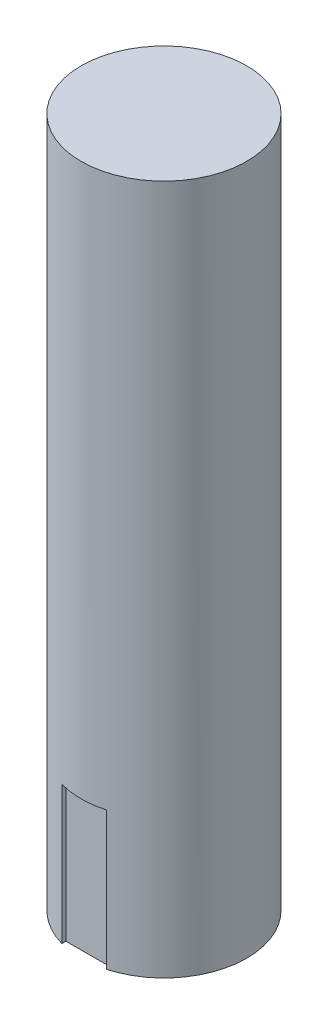
ISO-10303-21;
HEADER;
FILE_DESCRIPTION(('STEP AP214'),'2;1');
FILE_NAME('part.step','',(''),(''),'','','');
FILE_SCHEMA(('AUTOMOTIVE_DESIGN { 1 0 10303 214 1 1 1 1 }'));
ENDSEC;
DATA;
#1=APPLICATION_CONTEXT('core data for automotive mechanical design processes');
#2=APPLICATION_PROTOCOL_DEFINITION('international standard','automotive_design',2000,#1);
#3=PRODUCT_CONTEXT('',#1,'mechanical');
#4=PRODUCT('Part','Part','',(#3));
#5=PRODUCT_RELATED_PRODUCT_CATEGORY('part','',(#4));
#6=PRODUCT_DEFINITION_FORMATION('','',#4);
#7=PRODUCT_DEFINITION_CONTEXT('part definition',#1,'design');
#8=PRODUCT_DEFINITION('design','',#6,#7);
#9=PRODUCT_DEFINITION_SHAPE('','',#8);
#10=(LENGTH_UNIT() NAMED_UNIT(*) SI_UNIT(.MILLI.,.METRE.));
#11=(NAMED_UNIT(*) PLANE_ANGLE_UNIT() SI_UNIT($,.RADIAN.));
#12=(NAMED_UNIT(*) SI_UNIT($,.STERADIAN.) SOLID_ANGLE_UNIT());
#13=UNCERTAINTY_MEASURE_WITH_UNIT(LENGTH_MEASURE(1.E-05),#10,'distance_accuracy_value','');
#14=(GEOMETRIC_REPRESENTATION_CONTEXT(3) GLOBAL_UNCERTAINTY_ASSIGNED_CONTEXT((#13)) GLOBAL_UNIT_ASSIGNED_CONTEXT((#10,
#11,#12)) REPRESENTATION_CONTEXT('',''));
#15=CARTESIAN_POINT('',(0.,0.,0.));
#16=DIRECTION('',(0.,0.,1.));
#17=DIRECTION('',(1.,0.,0.));
#18=AXIS2_PLACEMENT_3D('',#15,#16,#17);
#19=CARTESIAN_POINT('',(0.,125.,0.));
#20=DIRECTION('',(0.,-1.,0.));
#21=DIRECTION('',(0.,0.,-1.));
#22=AXIS2_PLACEMENT_3D('',#19,#20,#21);
#23=CYLINDRICAL_SURFACE('',#22,30.);
#24=CARTESIAN_POINT('',(0.,125.,0.));
#25=DIRECTION('',(0.,1.,0.));
#26=DIRECTION('',(0.,0.,1.));
#27=AXIS2_PLACEMENT_3D('',#24,#25,#26);
#28=CIRCLE('',#27,30.);
#29=CARTESIAN_POINT('',(0.,125.,30.));
#30=VERTEX_POINT('',#29);
#31=EDGE_CURVE('E46',#30,#30,#28,.T.);
#32=ORIENTED_EDGE('',*,*,#31,.F.);
#33=EDGE_LOOP('',(#32));
#34=FACE_BOUND('',#33,.T.);
#35=DIRECTION('',(0.,-1.,0.));
#36=VECTOR('',#35,1.);
#37=CARTESIAN_POINT('',(-8.09533569525371,125.,28.8871171974836));
#38=LINE('',#37,#36);
#39=CARTESIAN_POINT('',(-8.09533569525371,-75.,28.8871171974836));
#40=VERTEX_POINT('',#39);
#41=CARTESIAN_POINT('',(-8.09533569525371,-125.,28.8871171974836));
#42=VERTEX_POINT('',#41);
#43=EDGE_CURVE('E105',#40,#42,#38,.T.);
#44=ORIENTED_EDGE('',*,*,#43,.F.);
#45=CARTESIAN_POINT('',(0.,-75.,0.));
#46=DIRECTION('',(0.,-1.,0.));
#47=DIRECTION('',(0.,0.,-1.));
#48=AXIS2_PLACEMENT_3D('',#45,#46,#47);
#49=CIRCLE('',#48,30.);
#50=CARTESIAN_POINT('',(8.09533569525371,-75.,28.8871171974836));
#51=VERTEX_POINT('',#50);
#52=EDGE_CURVE('E11',#51,#40,#49,.T.);
#53=ORIENTED_EDGE('',*,*,#52,.F.);
#54=DIRECTION('',(0.,-1.,0.));
#55=VECTOR('',#54,1.);
#56=CARTESIAN_POINT('',(8.09533569525371,125.,28.8871171974836));
#57=LINE('',#56,#55);
#58=CARTESIAN_POINT('',(8.09533569525371,-125.,28.8871171974836));
#59=VERTEX_POINT('',#58);
#60=EDGE_CURVE('E101',#51,#59,#57,.T.);
#61=ORIENTED_EDGE('',*,*,#60,.T.);
#62=CARTESIAN_POINT('',(0.,-125.,0.));
#63=DIRECTION('',(0.,1.,0.));
#64=DIRECTION('',(0.,0.,1.));
#65=AXIS2_PLACEMENT_3D('',#62,#63,#64);
#66=CIRCLE('',#65,30.);
#67=EDGE_CURVE('E107',#59,#42,#66,.T.);
#68=ORIENTED_EDGE('',*,*,#67,.T.);
#69=EDGE_LOOP('',(#44,#53,#61,#68));
#70=FACE_BOUND('',#69,.T.);
#71=ADVANCED_FACE('F39',(#34,#70),#23,.T.);
#72=CARTESIAN_POINT('',(0.,-125.,0.));
#73=DIRECTION('',(0.,1.,0.));
#74=DIRECTION('',(0.,0.,1.));
#75=AXIS2_PLACEMENT_3D('',#72,#73,#74);
#76=PLANE('',#75);
#77=DIRECTION('',(0.,0.,1.));
#78=VECTOR('',#77,1.);
#79=CARTESIAN_POINT('',(-8.09533569525371,-125.,0.));
#80=LINE('',#79,#78);
#81=CARTESIAN_POINT('',(-8.09533569525371,-125.,27.42));
#82=VERTEX_POINT('',#81);
#83=EDGE_CURVE('E53',#82,#42,#80,.T.);
#84=ORIENTED_EDGE('',*,*,#83,.T.);
#85=ORIENTED_EDGE('',*,*,#67,.F.);
#86=DIRECTION('',(0.,0.,1.));
#87=VECTOR('',#86,1.);
#88=CARTESIAN_POINT('',(8.09533569525371,-125.,0.));
#89=LINE('',#88,#87);
#90=CARTESIAN_POINT('',(8.09533569525371,-125.,27.42));
#91=VERTEX_POINT('',#90);
#92=EDGE_CURVE('E93',#91,#59,#89,.T.);
#93=ORIENTED_EDGE('',*,*,#92,.F.);
#94=DIRECTION('',(-1.,0.,0.));
#95=VECTOR('',#94,1.);
#96=CARTESIAN_POINT('',(0.,-125.,27.42));
#97=LINE('',#96,#95);
#98=EDGE_CURVE('E95',#91,#82,#97,.T.);
#99=ORIENTED_EDGE('',*,*,#98,.T.);
#100=EDGE_LOOP('',(#84,#85,#93,#99));
#101=FACE_BOUND('',#100,.T.);
#102=ADVANCED_FACE('F114',(#101),#76,.F.);
#103=CARTESIAN_POINT('',(0.,125.,0.));
#104=DIRECTION('',(0.,1.,0.));
#105=DIRECTION('',(0.,0.,1.));
#106=AXIS2_PLACEMENT_3D('',#103,#104,#105);
#107=PLANE('',#106);
#108=ORIENTED_EDGE('',*,*,#31,.T.);
#109=EDGE_LOOP('',(#108));
#110=FACE_BOUND('',#109,.T.);
#111=ADVANCED_FACE('F132',(#110),#107,.T.);
#112=CARTESIAN_POINT('',(0.,-75.,0.));
#113=DIRECTION('',(0.,-1.,0.));
#114=DIRECTION('',(0.,0.,-1.));
#115=AXIS2_PLACEMENT_3D('',#112,#113,#114);
#116=PLANE('',#115);
#117=ORIENTED_EDGE('',*,*,#52,.T.);
#118=DIRECTION('',(0.,0.,1.));
#119=VECTOR('',#118,1.);
#120=CARTESIAN_POINT('',(-8.09533569525371,-75.,0.));
#121=LINE('',#120,#119);
#122=CARTESIAN_POINT('',(-8.09533569525371,-75.,27.42));
#123=VERTEX_POINT('',#122);
#124=EDGE_CURVE('E87',#123,#40,#121,.T.);
#125=ORIENTED_EDGE('',*,*,#124,.F.);
#126=DIRECTION('',(-1.,0.,0.));
#127=VECTOR('',#126,1.);
#128=CARTESIAN_POINT('',(0.,-75.,27.42));
#129=LINE('',#128,#127);
#130=CARTESIAN_POINT('',(8.09533569525371,-75.,27.42));
#131=VERTEX_POINT('',#130);
#132=EDGE_CURVE('E79',#131,#123,#129,.T.);
#133=ORIENTED_EDGE('',*,*,#132,.F.);
#134=DIRECTION('',(0.,0.,1.));
#135=VECTOR('',#134,1.);
#136=CARTESIAN_POINT('',(8.09533569525371,-75.,0.));
#137=LINE('',#136,#135);
#138=EDGE_CURVE('E86',#131,#51,#137,.T.);
#139=ORIENTED_EDGE('',*,*,#138,.T.);
#140=EDGE_LOOP('',(#117,#125,#133,#139));
#141=FACE_BOUND('',#140,.T.);
#142=ADVANCED_FACE('F92',(#141),#116,.T.);
#143=CARTESIAN_POINT('',(-8.09533569525371,-75.,0.));
#144=DIRECTION('',(1.,0.,0.));
#145=DIRECTION('',(0.,0.,-1.));
#146=AXIS2_PLACEMENT_3D('',#143,#144,#145);
#147=PLANE('',#146);
#148=ORIENTED_EDGE('',*,*,#43,.T.);
#149=ORIENTED_EDGE('',*,*,#83,.F.);
#150=DIRECTION('',(0.,-1.,0.));
#151=VECTOR('',#150,1.);
#152=CARTESIAN_POINT('',(-8.09533569525371,-75.,27.42));
#153=LINE('',#152,#151);
#154=EDGE_CURVE('E82',#123,#82,#153,.T.);
#155=ORIENTED_EDGE('',*,*,#154,.F.);
#156=ORIENTED_EDGE('',*,*,#124,.T.);
#157=EDGE_LOOP('',(#148,#149,#155,#156));
#158=FACE_BOUND('',#157,.T.);
#159=ADVANCED_FACE('F89',(#158),#147,.T.);
#160=CARTESIAN_POINT('',(8.09533569525371,-75.,0.));
#161=DIRECTION('',(1.,0.,0.));
#162=DIRECTION('',(0.,0.,-1.));
#163=AXIS2_PLACEMENT_3D('',#160,#161,#162);
#164=PLANE('',#163);
#165=ORIENTED_EDGE('',*,*,#138,.F.);
#166=DIRECTION('',(0.,-1.,0.));
#167=VECTOR('',#166,1.);
#168=CARTESIAN_POINT('',(8.09533569525371,-75.,27.42));
#169=LINE('',#168,#167);
#170=EDGE_CURVE('E84',#131,#91,#169,.T.);
#171=ORIENTED_EDGE('',*,*,#170,.T.);
#172=ORIENTED_EDGE('',*,*,#92,.T.);
#173=ORIENTED_EDGE('',*,*,#60,.F.);
#174=EDGE_LOOP('',(#165,#171,#172,#173));
#175=FACE_BOUND('',#174,.T.);
#176=ADVANCED_FACE('F116',(#175),#164,.F.);
#177=CARTESIAN_POINT('',(0.,-75.,27.42));
#178=DIRECTION('',(0.,0.,1.));
#179=DIRECTION('',(1.,0.,0.));
#180=AXIS2_PLACEMENT_3D('',#177,#178,#179);
#181=PLANE('',#180);
#182=ORIENTED_EDGE('',*,*,#98,.F.);
#183=ORIENTED_EDGE('',*,*,#170,.F.);
#184=ORIENTED_EDGE('',*,*,#132,.T.);
#185=ORIENTED_EDGE('',*,*,#154,.T.);
#186=EDGE_LOOP('',(#182,#183,#184,#185));
#187=FACE_BOUND('',#186,.T.);
#188=ADVANCED_FACE('F81',(#187),#181,.T.);
#189=CLOSED_SHELL('',(#71,#102,#111,#142,#159,#176,#188));
#190=MANIFOLD_SOLID_BREP('B2',#189);
#191=ADVANCED_BREP_SHAPE_REPRESENTATION('',(#18,#190),#14);
#192=SHAPE_DEFINITION_REPRESENTATION(#9,#191);
ENDSEC;
END-ISO-10303-21;
